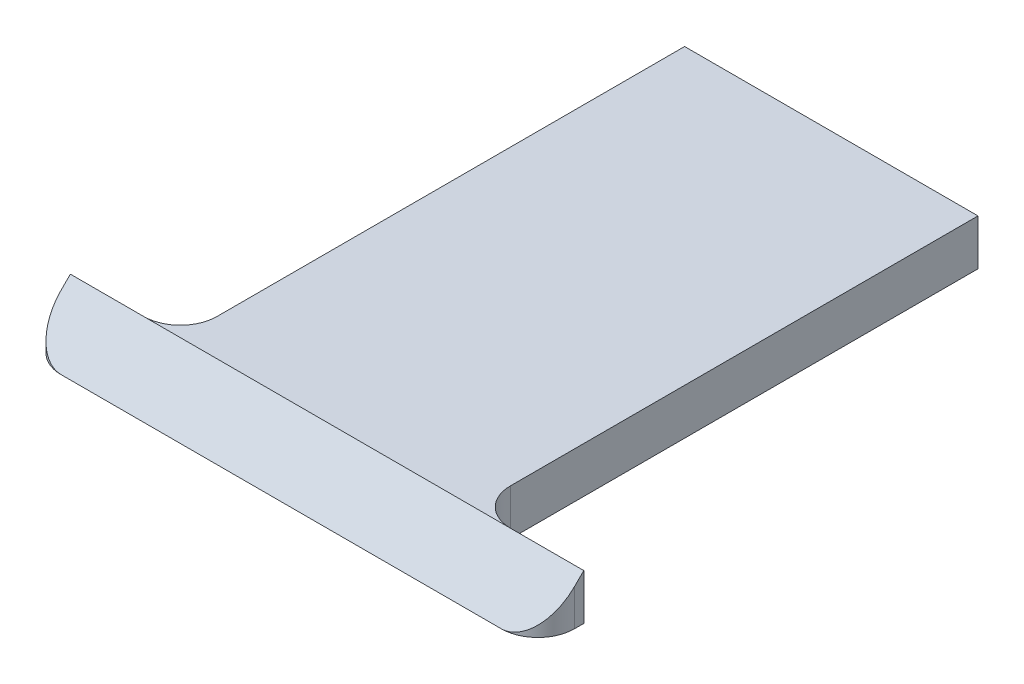
ISO-10303-21;
HEADER;
FILE_DESCRIPTION(('STEP AP214'),'2;1');
FILE_NAME('part.step','',(''),(''),'','','');
FILE_SCHEMA(('AUTOMOTIVE_DESIGN { 1 0 10303 214 1 1 1 1 }'));
ENDSEC;
DATA;
#1=APPLICATION_CONTEXT('core data for automotive mechanical design processes');
#2=APPLICATION_PROTOCOL_DEFINITION('international standard','automotive_design',2000,#1);
#3=PRODUCT_CONTEXT('',#1,'mechanical');
#4=PRODUCT('Part','Part','',(#3));
#5=PRODUCT_RELATED_PRODUCT_CATEGORY('part','',(#4));
#6=PRODUCT_DEFINITION_FORMATION('','',#4);
#7=PRODUCT_DEFINITION_CONTEXT('part definition',#1,'design');
#8=PRODUCT_DEFINITION('design','',#6,#7);
#9=PRODUCT_DEFINITION_SHAPE('','',#8);
#10=(LENGTH_UNIT() NAMED_UNIT(*) SI_UNIT(.MILLI.,.METRE.));
#11=(NAMED_UNIT(*) PLANE_ANGLE_UNIT() SI_UNIT($,.RADIAN.));
#12=(NAMED_UNIT(*) SI_UNIT($,.STERADIAN.) SOLID_ANGLE_UNIT());
#13=UNCERTAINTY_MEASURE_WITH_UNIT(LENGTH_MEASURE(1.E-05),#10,'distance_accuracy_value','');
#14=(GEOMETRIC_REPRESENTATION_CONTEXT(3) GLOBAL_UNCERTAINTY_ASSIGNED_CONTEXT((#13)) GLOBAL_UNIT_ASSIGNED_CONTEXT((#10,
#11,#12)) REPRESENTATION_CONTEXT('',''));
#15=CARTESIAN_POINT('',(0.,0.,0.));
#16=DIRECTION('',(0.,0.,1.));
#17=DIRECTION('',(1.,0.,0.));
#18=AXIS2_PLACEMENT_3D('',#15,#16,#17);
#19=CARTESIAN_POINT('',(0.,12.5,-12.5));
#20=DIRECTION('',(1.,0.,0.));
#21=DIRECTION('',(0.,0.,-1.));
#22=AXIS2_PLACEMENT_3D('',#19,#20,#21);
#23=PLANE('',#22);
#24=DIRECTION('',(0.,-1.,0.));
#25=VECTOR('',#24,1.);
#26=CARTESIAN_POINT('',(0.,12.5,-10.));
#27=LINE('',#26,#25);
#28=CARTESIAN_POINT('',(0.,0.,-10.));
#29=VERTEX_POINT('',#28);
#30=CARTESIAN_POINT('',(0.,9.99999999999998,-10.));
#31=VERTEX_POINT('',#30);
#32=EDGE_CURVE('E187',#29,#31,#27,.F.);
#33=ORIENTED_EDGE('',*,*,#32,.T.);
#34=DIRECTION('',(0.,0.707106781186547,-0.707106781186548));
#35=VECTOR('',#34,1.);
#36=CARTESIAN_POINT('',(0.,12.5,-12.5));
#37=LINE('',#36,#35);
#38=CARTESIAN_POINT('',(0.,12.5,-12.5));
#39=VERTEX_POINT('',#38);
#40=EDGE_CURVE('E242',#31,#39,#37,.T.);
#41=ORIENTED_EDGE('',*,*,#40,.T.);
#42=DIRECTION('',(0.,-1.,0.));
#43=VECTOR('',#42,1.);
#44=CARTESIAN_POINT('',(0.,12.5,-12.5));
#45=LINE('',#44,#43);
#46=CARTESIAN_POINT('',(0.,0.,-12.5));
#47=VERTEX_POINT('',#46);
#48=EDGE_CURVE('E159',#39,#47,#45,.T.);
#49=ORIENTED_EDGE('',*,*,#48,.T.);
#50=DIRECTION('',(0.,0.,1.));
#51=VECTOR('',#50,1.);
#52=CARTESIAN_POINT('',(0.,0.,-12.5));
#53=LINE('',#52,#51);
#54=EDGE_CURVE('E160',#47,#29,#53,.T.);
#55=ORIENTED_EDGE('',*,*,#54,.T.);
#56=EDGE_LOOP('',(#33,#41,#49,#55));
#57=FACE_BOUND('',#56,.T.);
#58=ADVANCED_FACE('F41',(#57),#23,.F.);
#59=CARTESIAN_POINT('',(140.,12.5,0.));
#60=DIRECTION('',(-1.,0.,0.));
#61=DIRECTION('',(0.,0.,1.));
#62=AXIS2_PLACEMENT_3D('',#59,#60,#61);
#63=PLANE('',#62);
#64=DIRECTION('',(0.,-1.,0.));
#65=VECTOR('',#64,1.);
#66=CARTESIAN_POINT('',(140.,12.5,-12.5));
#67=LINE('',#66,#65);
#68=CARTESIAN_POINT('',(140.,12.5,-12.5));
#69=VERTEX_POINT('',#68);
#70=CARTESIAN_POINT('',(140.,0.,-12.5));
#71=VERTEX_POINT('',#70);
#72=EDGE_CURVE('E129',#69,#71,#67,.T.);
#73=ORIENTED_EDGE('',*,*,#72,.F.);
#74=DIRECTION('',(0.,0.707106781186547,-0.707106781186548));
#75=VECTOR('',#74,1.);
#76=CARTESIAN_POINT('',(140.,0.,0.));
#77=LINE('',#76,#75);
#78=CARTESIAN_POINT('',(140.,9.99999999999999,-10.));
#79=VERTEX_POINT('',#78);
#80=EDGE_CURVE('E117',#79,#69,#77,.T.);
#81=ORIENTED_EDGE('',*,*,#80,.F.);
#82=DIRECTION('',(0.,-1.,0.));
#83=VECTOR('',#82,1.);
#84=CARTESIAN_POINT('',(140.,12.5,-10.));
#85=LINE('',#84,#83);
#86=CARTESIAN_POINT('',(140.,0.,-10.));
#87=VERTEX_POINT('',#86);
#88=EDGE_CURVE('E136',#79,#87,#85,.T.);
#89=ORIENTED_EDGE('',*,*,#88,.T.);
#90=DIRECTION('',(0.,0.,-1.));
#91=VECTOR('',#90,1.);
#92=CARTESIAN_POINT('',(140.,0.,0.));
#93=LINE('',#92,#91);
#94=EDGE_CURVE('E132',#87,#71,#93,.T.);
#95=ORIENTED_EDGE('',*,*,#94,.T.);
#96=EDGE_LOOP('',(#73,#81,#89,#95));
#97=FACE_BOUND('',#96,.T.);
#98=ADVANCED_FACE('F130',(#97),#63,.F.);
#99=CARTESIAN_POINT('',(140.,12.5,-12.5));
#100=DIRECTION('',(0.,0.,1.));
#101=DIRECTION('',(1.,0.,0.));
#102=AXIS2_PLACEMENT_3D('',#99,#100,#101);
#103=PLANE('',#102);
#104=DIRECTION('',(-1.,0.,0.));
#105=VECTOR('',#104,1.);
#106=CARTESIAN_POINT('',(140.,0.,-12.5));
#107=LINE('',#106,#105);
#108=CARTESIAN_POINT('',(120.,0.,-12.5));
#109=VERTEX_POINT('',#108);
#110=EDGE_CURVE('E166',#71,#109,#107,.T.);
#111=ORIENTED_EDGE('',*,*,#110,.T.);
#112=DIRECTION('',(0.,-1.,0.));
#113=VECTOR('',#112,1.);
#114=CARTESIAN_POINT('',(120.,12.5,-12.5));
#115=LINE('',#114,#113);
#116=CARTESIAN_POINT('',(120.,12.5,-12.5));
#117=VERTEX_POINT('',#116);
#118=EDGE_CURVE('E142',#109,#117,#115,.F.);
#119=ORIENTED_EDGE('',*,*,#118,.T.);
#120=DIRECTION('',(-1.,0.,0.));
#121=VECTOR('',#120,1.);
#122=CARTESIAN_POINT('',(140.,12.5,-12.5));
#123=LINE('',#122,#121);
#124=EDGE_CURVE('E121',#69,#117,#123,.T.);
#125=ORIENTED_EDGE('',*,*,#124,.F.);
#126=ORIENTED_EDGE('',*,*,#72,.T.);
#127=EDGE_LOOP('',(#111,#119,#125,#126));
#128=FACE_BOUND('',#127,.T.);
#129=ADVANCED_FACE('F140',(#128),#103,.F.);
#130=CARTESIAN_POINT('',(110.,12.5,-12.5));
#131=DIRECTION('',(-1.,0.,0.));
#132=DIRECTION('',(0.,0.,1.));
#133=AXIS2_PLACEMENT_3D('',#130,#131,#132);
#134=PLANE('',#133);
#135=DIRECTION('',(0.,0.,-1.));
#136=VECTOR('',#135,1.);
#137=CARTESIAN_POINT('',(110.,12.5,-12.5));
#138=LINE('',#137,#136);
#139=CARTESIAN_POINT('',(110.,12.5,-22.5));
#140=VERTEX_POINT('',#139);
#141=CARTESIAN_POINT('',(110.,12.5,-150.));
#142=VERTEX_POINT('',#141);
#143=EDGE_CURVE('E143',#140,#142,#138,.T.);
#144=ORIENTED_EDGE('',*,*,#143,.F.);
#145=DIRECTION('',(0.,-1.,0.));
#146=VECTOR('',#145,1.);
#147=CARTESIAN_POINT('',(110.,0.,-22.5));
#148=LINE('',#147,#146);
#149=CARTESIAN_POINT('',(110.,0.,-22.5));
#150=VERTEX_POINT('',#149);
#151=EDGE_CURVE('E197',#140,#150,#148,.T.);
#152=ORIENTED_EDGE('',*,*,#151,.T.);
#153=DIRECTION('',(0.,0.,-1.));
#154=VECTOR('',#153,1.);
#155=CARTESIAN_POINT('',(110.,0.,-12.5));
#156=LINE('',#155,#154);
#157=CARTESIAN_POINT('',(110.,0.,-150.));
#158=VERTEX_POINT('',#157);
#159=EDGE_CURVE('E168',#150,#158,#156,.T.);
#160=ORIENTED_EDGE('',*,*,#159,.T.);
#161=DIRECTION('',(0.,-1.,0.));
#162=VECTOR('',#161,1.);
#163=CARTESIAN_POINT('',(110.,12.5,-150.));
#164=LINE('',#163,#162);
#165=EDGE_CURVE('E137',#142,#158,#164,.T.);
#166=ORIENTED_EDGE('',*,*,#165,.F.);
#167=EDGE_LOOP('',(#144,#152,#160,#166));
#168=FACE_BOUND('',#167,.T.);
#169=ADVANCED_FACE('F216',(#168),#134,.F.);
#170=CARTESIAN_POINT('',(110.,12.5,-150.));
#171=DIRECTION('',(0.,0.,1.));
#172=DIRECTION('',(1.,0.,0.));
#173=AXIS2_PLACEMENT_3D('',#170,#171,#172);
#174=PLANE('',#173);
#175=DIRECTION('',(-1.,0.,0.));
#176=VECTOR('',#175,1.);
#177=CARTESIAN_POINT('',(110.,0.,-150.));
#178=LINE('',#177,#176);
#179=CARTESIAN_POINT('',(30.,0.,-150.));
#180=VERTEX_POINT('',#179);
#181=EDGE_CURVE('E170',#158,#180,#178,.T.);
#182=ORIENTED_EDGE('',*,*,#181,.T.);
#183=DIRECTION('',(0.,-1.,0.));
#184=VECTOR('',#183,1.);
#185=CARTESIAN_POINT('',(30.,12.5,-150.));
#186=LINE('',#185,#184);
#187=CARTESIAN_POINT('',(30.,12.5,-150.));
#188=VERTEX_POINT('',#187);
#189=EDGE_CURVE('E176',#188,#180,#186,.T.);
#190=ORIENTED_EDGE('',*,*,#189,.F.);
#191=DIRECTION('',(-1.,0.,0.));
#192=VECTOR('',#191,1.);
#193=CARTESIAN_POINT('',(110.,12.5,-150.));
#194=LINE('',#193,#192);
#195=EDGE_CURVE('E146',#142,#188,#194,.T.);
#196=ORIENTED_EDGE('',*,*,#195,.F.);
#197=ORIENTED_EDGE('',*,*,#165,.T.);
#198=EDGE_LOOP('',(#182,#190,#196,#197));
#199=FACE_BOUND('',#198,.T.);
#200=ADVANCED_FACE('F220',(#199),#174,.F.);
#201=CARTESIAN_POINT('',(30.,12.5,-150.));
#202=DIRECTION('',(1.,0.,0.));
#203=DIRECTION('',(0.,0.,-1.));
#204=AXIS2_PLACEMENT_3D('',#201,#202,#203);
#205=PLANE('',#204);
#206=DIRECTION('',(0.,0.,1.));
#207=VECTOR('',#206,1.);
#208=CARTESIAN_POINT('',(30.,0.,-150.));
#209=LINE('',#208,#207);
#210=CARTESIAN_POINT('',(30.,0.,-22.5));
#211=VERTEX_POINT('',#210);
#212=EDGE_CURVE('E148',#180,#211,#209,.T.);
#213=ORIENTED_EDGE('',*,*,#212,.T.);
#214=DIRECTION('',(0.,-1.,0.));
#215=VECTOR('',#214,1.);
#216=CARTESIAN_POINT('',(30.,12.5,-22.5));
#217=LINE('',#216,#215);
#218=CARTESIAN_POINT('',(30.,12.5,-22.5));
#219=VERTEX_POINT('',#218);
#220=EDGE_CURVE('E195',#211,#219,#217,.F.);
#221=ORIENTED_EDGE('',*,*,#220,.T.);
#222=DIRECTION('',(0.,0.,1.));
#223=VECTOR('',#222,1.);
#224=CARTESIAN_POINT('',(30.,12.5,-150.));
#225=LINE('',#224,#223);
#226=EDGE_CURVE('E154',#188,#219,#225,.T.);
#227=ORIENTED_EDGE('',*,*,#226,.F.);
#228=ORIENTED_EDGE('',*,*,#189,.T.);
#229=EDGE_LOOP('',(#213,#221,#227,#228));
#230=FACE_BOUND('',#229,.T.);
#231=ADVANCED_FACE('F268',(#230),#205,.F.);
#232=CARTESIAN_POINT('',(30.,12.5,-12.5));
#233=DIRECTION('',(0.,0.,1.));
#234=DIRECTION('',(1.,0.,0.));
#235=AXIS2_PLACEMENT_3D('',#232,#233,#234);
#236=PLANE('',#235);
#237=DIRECTION('',(-1.,0.,0.));
#238=VECTOR('',#237,1.);
#239=CARTESIAN_POINT('',(30.,12.5,-12.5));
#240=LINE('',#239,#238);
#241=CARTESIAN_POINT('',(20.,12.5,-12.5));
#242=VERTEX_POINT('',#241);
#243=EDGE_CURVE('E157',#242,#39,#240,.T.);
#244=ORIENTED_EDGE('',*,*,#243,.F.);
#245=DIRECTION('',(0.,-1.,0.));
#246=VECTOR('',#245,1.);
#247=CARTESIAN_POINT('',(20.,0.,-12.5));
#248=LINE('',#247,#246);
#249=CARTESIAN_POINT('',(20.,0.,-12.5));
#250=VERTEX_POINT('',#249);
#251=EDGE_CURVE('E192',#242,#250,#248,.T.);
#252=ORIENTED_EDGE('',*,*,#251,.T.);
#253=DIRECTION('',(-1.,0.,0.));
#254=VECTOR('',#253,1.);
#255=CARTESIAN_POINT('',(30.,0.,-12.5));
#256=LINE('',#255,#254);
#257=EDGE_CURVE('E144',#250,#47,#256,.T.);
#258=ORIENTED_EDGE('',*,*,#257,.T.);
#259=ORIENTED_EDGE('',*,*,#48,.F.);
#260=EDGE_LOOP('',(#244,#252,#258,#259));
#261=FACE_BOUND('',#260,.T.);
#262=ADVANCED_FACE('F230',(#261),#236,.F.);
#263=CARTESIAN_POINT('',(0.,12.5,0.));
#264=DIRECTION('',(0.,1.,0.));
#265=DIRECTION('',(0.,0.,1.));
#266=AXIS2_PLACEMENT_3D('',#263,#264,#265);
#267=PLANE('',#266);
#268=DIRECTION('',(1.,0.,0.));
#269=VECTOR('',#268,1.);
#270=CARTESIAN_POINT('',(-1.2E-05,12.5,-12.5));
#271=LINE('',#270,#269);
#272=EDGE_CURVE('E56',#242,#117,#271,.T.);
#273=ORIENTED_EDGE('',*,*,#272,.T.);
#274=CARTESIAN_POINT('',(120.,12.5,-22.5));
#275=DIRECTION('',(0.,1.,0.));
#276=DIRECTION('',(0.,0.,1.));
#277=AXIS2_PLACEMENT_3D('',#274,#275,#276);
#278=CIRCLE('',#277,10.);
#279=EDGE_CURVE('E11',#117,#140,#278,.F.);
#280=ORIENTED_EDGE('',*,*,#279,.T.);
#281=ORIENTED_EDGE('',*,*,#143,.T.);
#282=ORIENTED_EDGE('',*,*,#195,.T.);
#283=ORIENTED_EDGE('',*,*,#226,.T.);
#284=CARTESIAN_POINT('',(20.,12.5,-22.5));
#285=DIRECTION('',(0.,1.,0.));
#286=DIRECTION('',(0.,0.,1.));
#287=AXIS2_PLACEMENT_3D('',#284,#285,#286);
#288=CIRCLE('',#287,10.);
#289=EDGE_CURVE('E203',#219,#242,#288,.F.);
#290=ORIENTED_EDGE('',*,*,#289,.T.);
#291=EDGE_LOOP('',(#273,#280,#281,#282,#283,#290));
#292=FACE_BOUND('',#291,.T.);
#293=ADVANCED_FACE('F213',(#292),#267,.T.);
#294=CARTESIAN_POINT('',(0.,0.,0.));
#295=DIRECTION('',(0.,1.,0.));
#296=DIRECTION('',(0.,0.,1.));
#297=AXIS2_PLACEMENT_3D('',#294,#295,#296);
#298=PLANE('',#297);
#299=ORIENTED_EDGE('',*,*,#94,.F.);
#300=CARTESIAN_POINT('',(130.,0.,-10.));
#301=DIRECTION('',(0.,1.,0.));
#302=DIRECTION('',(0.,0.,1.));
#303=AXIS2_PLACEMENT_3D('',#300,#301,#302);
#304=CIRCLE('',#303,10.);
#305=CARTESIAN_POINT('',(130.,0.,0.));
#306=VERTEX_POINT('',#305);
#307=EDGE_CURVE('E184',#87,#306,#304,.F.);
#308=ORIENTED_EDGE('',*,*,#307,.T.);
#309=DIRECTION('',(1.,0.,0.));
#310=VECTOR('',#309,1.);
#311=CARTESIAN_POINT('',(0.,0.,0.));
#312=LINE('',#311,#310);
#313=CARTESIAN_POINT('',(10.,0.,0.));
#314=VERTEX_POINT('',#313);
#315=EDGE_CURVE('E163',#314,#306,#312,.T.);
#316=ORIENTED_EDGE('',*,*,#315,.F.);
#317=CARTESIAN_POINT('',(10.,0.,-10.));
#318=DIRECTION('',(0.,1.,0.));
#319=DIRECTION('',(0.,0.,1.));
#320=AXIS2_PLACEMENT_3D('',#317,#318,#319);
#321=CIRCLE('',#320,10.);
#322=EDGE_CURVE('E182',#314,#29,#321,.F.);
#323=ORIENTED_EDGE('',*,*,#322,.T.);
#324=ORIENTED_EDGE('',*,*,#54,.F.);
#325=ORIENTED_EDGE('',*,*,#257,.F.);
#326=CARTESIAN_POINT('',(20.,0.,-22.5));
#327=DIRECTION('',(0.,1.,0.));
#328=DIRECTION('',(0.,0.,1.));
#329=AXIS2_PLACEMENT_3D('',#326,#327,#328);
#330=CIRCLE('',#329,10.);
#331=EDGE_CURVE('E201',#250,#211,#330,.T.);
#332=ORIENTED_EDGE('',*,*,#331,.T.);
#333=ORIENTED_EDGE('',*,*,#212,.F.);
#334=ORIENTED_EDGE('',*,*,#181,.F.);
#335=ORIENTED_EDGE('',*,*,#159,.F.);
#336=CARTESIAN_POINT('',(120.,0.,-22.5));
#337=DIRECTION('',(0.,1.,0.));
#338=DIRECTION('',(0.,0.,1.));
#339=AXIS2_PLACEMENT_3D('',#336,#337,#338);
#340=CIRCLE('',#339,10.);
#341=EDGE_CURVE('E50',#150,#109,#340,.T.);
#342=ORIENTED_EDGE('',*,*,#341,.T.);
#343=ORIENTED_EDGE('',*,*,#110,.F.);
#344=EDGE_LOOP('',(#299,#308,#316,#323,#324,#325,#332,#333,#334,#335,#342,#343));
#345=FACE_BOUND('',#344,.T.);
#346=ADVANCED_FACE('F207',(#345),#298,.F.);
#347=CARTESIAN_POINT('',(130.,12.5,-10.));
#348=DIRECTION('',(0.,-1.,0.));
#349=DIRECTION('',(0.,0.,-1.));
#350=AXIS2_PLACEMENT_3D('',#347,#348,#349);
#351=CYLINDRICAL_SURFACE('',#350,10.);
#352=CARTESIAN_POINT('',(130.,9.99999999999998,-10.));
#353=DIRECTION('',(0.,-0.707106781186548,-0.707106781186547));
#354=DIRECTION('',(0.,-0.707106781186547,0.707106781186548));
#355=AXIS2_PLACEMENT_3D('',#352,#353,#354);
#356=ELLIPSE('',#355,14.1421356237309,10.);
#357=EDGE_CURVE('E124',#306,#79,#356,.F.);
#358=ORIENTED_EDGE('',*,*,#357,.F.);
#359=ORIENTED_EDGE('',*,*,#307,.F.);
#360=ORIENTED_EDGE('',*,*,#88,.F.);
#361=EDGE_LOOP('',(#358,#359,#360));
#362=FACE_BOUND('',#361,.T.);
#363=ADVANCED_FACE('F246',(#362),#351,.T.);
#364=CARTESIAN_POINT('',(10.,12.5,-10.));
#365=DIRECTION('',(0.,-1.,0.));
#366=DIRECTION('',(0.,0.,-1.));
#367=AXIS2_PLACEMENT_3D('',#364,#365,#366);
#368=CYLINDRICAL_SURFACE('',#367,10.);
#369=CARTESIAN_POINT('',(10.,9.99999999999998,-10.));
#370=DIRECTION('',(0.,-0.707106781186548,-0.707106781186547));
#371=DIRECTION('',(0.,-0.707106781186547,0.707106781186548));
#372=AXIS2_PLACEMENT_3D('',#369,#370,#371);
#373=ELLIPSE('',#372,14.1421356237309,10.);
#374=EDGE_CURVE('E190',#31,#314,#373,.F.);
#375=ORIENTED_EDGE('',*,*,#374,.F.);
#376=ORIENTED_EDGE('',*,*,#32,.F.);
#377=ORIENTED_EDGE('',*,*,#322,.F.);
#378=EDGE_LOOP('',(#375,#376,#377));
#379=FACE_BOUND('',#378,.T.);
#380=ADVANCED_FACE('F241',(#379),#368,.T.);
#381=CARTESIAN_POINT('',(-1.2E-05,0.,0.));
#382=DIRECTION('',(0.,-0.707106781186548,-0.707106781186547));
#383=DIRECTION('',(0.,0.707106781186547,-0.707106781186548));
#384=AXIS2_PLACEMENT_3D('',#381,#382,#383);
#385=PLANE('',#384);
#386=ORIENTED_EDGE('',*,*,#357,.T.);
#387=ORIENTED_EDGE('',*,*,#80,.T.);
#388=ORIENTED_EDGE('',*,*,#124,.T.);
#389=ORIENTED_EDGE('',*,*,#272,.F.);
#390=ORIENTED_EDGE('',*,*,#243,.T.);
#391=ORIENTED_EDGE('',*,*,#40,.F.);
#392=ORIENTED_EDGE('',*,*,#374,.T.);
#393=ORIENTED_EDGE('',*,*,#315,.T.);
#394=EDGE_LOOP('',(#386,#387,#388,#389,#390,#391,#392,#393));
#395=FACE_BOUND('',#394,.T.);
#396=ADVANCED_FACE('F119',(#395),#385,.F.);
#397=CARTESIAN_POINT('',(20.,12.5,-22.5));
#398=DIRECTION('',(0.,1.,0.));
#399=DIRECTION('',(0.,0.,1.));
#400=AXIS2_PLACEMENT_3D('',#397,#398,#399);
#401=CYLINDRICAL_SURFACE('',#400,10.);
#402=ORIENTED_EDGE('',*,*,#289,.F.);
#403=ORIENTED_EDGE('',*,*,#220,.F.);
#404=ORIENTED_EDGE('',*,*,#331,.F.);
#405=ORIENTED_EDGE('',*,*,#251,.F.);
#406=EDGE_LOOP('',(#402,#403,#404,#405));
#407=FACE_BOUND('',#406,.T.);
#408=ADVANCED_FACE('F227',(#407),#401,.F.);
#409=CARTESIAN_POINT('',(120.,12.5,-22.5));
#410=DIRECTION('',(0.,1.,0.));
#411=DIRECTION('',(0.,0.,1.));
#412=AXIS2_PLACEMENT_3D('',#409,#410,#411);
#413=CYLINDRICAL_SURFACE('',#412,10.);
#414=ORIENTED_EDGE('',*,*,#279,.F.);
#415=ORIENTED_EDGE('',*,*,#118,.F.);
#416=ORIENTED_EDGE('',*,*,#341,.F.);
#417=ORIENTED_EDGE('',*,*,#151,.F.);
#418=EDGE_LOOP('',(#414,#415,#416,#417));
#419=FACE_BOUND('',#418,.T.);
#420=ADVANCED_FACE('F43',(#419),#413,.F.);
#421=CLOSED_SHELL('',(#58,#98,#129,#169,#200,#231,#262,#293,#346,#363,#380,#396,#408,#420));
#422=MANIFOLD_SOLID_BREP('B2',#421);
#423=ADVANCED_BREP_SHAPE_REPRESENTATION('',(#18,#422),#14);
#424=SHAPE_DEFINITION_REPRESENTATION(#9,#423);
ENDSEC;
END-ISO-10303-21;
